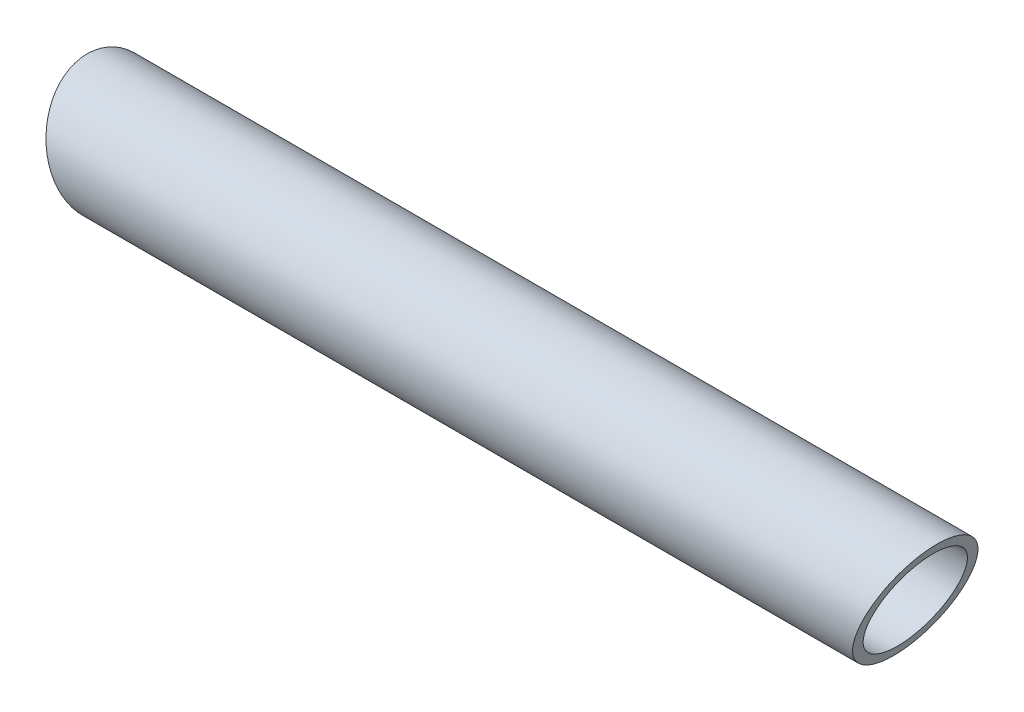
ISO-10303-21;
HEADER;
FILE_DESCRIPTION(('STEP AP214'),'2;1');
FILE_NAME('part.step','',(''),(''),'','','');
FILE_SCHEMA(('AUTOMOTIVE_DESIGN { 1 0 10303 214 1 1 1 1 }'));
ENDSEC;
DATA;
#1=APPLICATION_CONTEXT('core data for automotive mechanical design processes');
#2=APPLICATION_PROTOCOL_DEFINITION('international standard','automotive_design',2000,#1);
#3=PRODUCT_CONTEXT('',#1,'mechanical');
#4=PRODUCT('Part','Part','',(#3));
#5=PRODUCT_RELATED_PRODUCT_CATEGORY('part','',(#4));
#6=PRODUCT_DEFINITION_FORMATION('','',#4);
#7=PRODUCT_DEFINITION_CONTEXT('part definition',#1,'design');
#8=PRODUCT_DEFINITION('design','',#6,#7);
#9=PRODUCT_DEFINITION_SHAPE('','',#8);
#10=(LENGTH_UNIT() NAMED_UNIT(*) SI_UNIT(.MILLI.,.METRE.));
#11=(NAMED_UNIT(*) PLANE_ANGLE_UNIT() SI_UNIT($,.RADIAN.));
#12=(NAMED_UNIT(*) SI_UNIT($,.STERADIAN.) SOLID_ANGLE_UNIT());
#13=UNCERTAINTY_MEASURE_WITH_UNIT(LENGTH_MEASURE(1.E-05),#10,'distance_accuracy_value','');
#14=(GEOMETRIC_REPRESENTATION_CONTEXT(3) GLOBAL_UNCERTAINTY_ASSIGNED_CONTEXT((#13)) GLOBAL_UNIT_ASSIGNED_CONTEXT((#10,
#11,#12)) REPRESENTATION_CONTEXT('',''));
#15=CARTESIAN_POINT('',(0.,0.,0.));
#16=DIRECTION('',(0.,0.,1.));
#17=DIRECTION('',(1.,0.,0.));
#18=AXIS2_PLACEMENT_3D('',#15,#16,#17);
#19=CARTESIAN_POINT('',(-65.0000000000001,580.,-1140.));
#20=DIRECTION('',(1.,0.,0.));
#21=DIRECTION('',(0.,0.,-1.));
#22=AXIS2_PLACEMENT_3D('',#19,#20,#21);
#23=CYLINDRICAL_SURFACE('',#22,7.90000000000002);
#24=CARTESIAN_POINT('',(-64.9999999999999,580.,-1140.));
#25=DIRECTION('',(-0.939391078868926,-0.342847489332319,0.));
#26=DIRECTION('',(0.342847489332319,-0.939391078868926,0.));
#27=AXIS2_PLACEMENT_3D('',#24,#25,#26);
#28=ELLIPSE('',#27,8.40970302753142,7.90000000000002);
#29=CARTESIAN_POINT('',(-62.1167544309804,572.1,-1140.));
#30=VERTEX_POINT('',#29);
#31=EDGE_CURVE('E53',#30,#30,#28,.T.);
#32=ORIENTED_EDGE('',*,*,#31,.T.);
#33=EDGE_LOOP('',(#32));
#34=FACE_BOUND('',#33,.T.);
#35=CARTESIAN_POINT('',(64.9999999999999,580.,-1140.));
#36=DIRECTION('',(0.939391078868926,-0.342847489332319,0.));
#37=DIRECTION('',(0.342847489332319,0.939391078868926,0.));
#38=AXIS2_PLACEMENT_3D('',#35,#36,#37);
#39=ELLIPSE('',#38,8.40970302753142,7.90000000000002);
#40=CARTESIAN_POINT('',(67.8832455690194,587.9,-1140.));
#41=VERTEX_POINT('',#40);
#42=EDGE_CURVE('E43',#41,#41,#39,.T.);
#43=ORIENTED_EDGE('',*,*,#42,.T.);
#44=EDGE_LOOP('',(#43));
#45=FACE_BOUND('',#44,.T.);
#46=ADVANCED_FACE('F39',(#34,#45),#23,.F.);
#47=CARTESIAN_POINT('',(-65.0000000000001,580.,-1140.));
#48=DIRECTION('',(1.,0.,0.));
#49=DIRECTION('',(0.,0.,-1.));
#50=AXIS2_PLACEMENT_3D('',#47,#48,#49);
#51=CYLINDRICAL_SURFACE('',#50,9.49999999999999);
#52=CARTESIAN_POINT('',(-64.9999999999999,580.,-1140.));
#53=DIRECTION('',(-0.939391078868926,-0.342847489332319,0.));
#54=DIRECTION('',(0.342847489332319,-0.939391078868926,0.));
#55=AXIS2_PLACEMENT_3D('',#52,#53,#54);
#56=ELLIPSE('',#55,10.1129340204491,9.49999999999999);
#57=CARTESIAN_POINT('',(-61.5328059613055,570.5,-1140.));
#58=VERTEX_POINT('',#57);
#59=EDGE_CURVE('E47',#58,#58,#56,.T.);
#60=ORIENTED_EDGE('',*,*,#59,.F.);
#61=EDGE_LOOP('',(#60));
#62=FACE_BOUND('',#61,.T.);
#63=CARTESIAN_POINT('',(64.9999999999999,580.,-1140.));
#64=DIRECTION('',(0.939391078868926,-0.342847489332319,0.));
#65=DIRECTION('',(0.342847489332319,0.939391078868926,0.));
#66=AXIS2_PLACEMENT_3D('',#63,#64,#65);
#67=ELLIPSE('',#66,10.1129340204491,9.49999999999999);
#68=CARTESIAN_POINT('',(68.4671940386943,589.5,-1140.));
#69=VERTEX_POINT('',#68);
#70=EDGE_CURVE('E10',#69,#69,#67,.T.);
#71=ORIENTED_EDGE('',*,*,#70,.F.);
#72=EDGE_LOOP('',(#71));
#73=FACE_BOUND('',#72,.T.);
#74=ADVANCED_FACE('F67',(#62,#73),#51,.T.);
#75=CARTESIAN_POINT('',(-65.,580.,-1140.));
#76=DIRECTION('',(-0.939391078868926,-0.342847489332319,0.));
#77=DIRECTION('',(0.342847489332319,-0.939391078868926,0.));
#78=AXIS2_PLACEMENT_3D('',#75,#76,#77);
#79=PLANE('',#78);
#80=ORIENTED_EDGE('',*,*,#31,.F.);
#81=EDGE_LOOP('',(#80));
#82=FACE_BOUND('',#81,.T.);
#83=ORIENTED_EDGE('',*,*,#59,.T.);
#84=EDGE_LOOP('',(#83));
#85=FACE_BOUND('',#84,.T.);
#86=ADVANCED_FACE('F62',(#82,#85),#79,.T.);
#87=CARTESIAN_POINT('',(65.,580.,-1140.));
#88=DIRECTION('',(0.939391078868926,-0.342847489332319,0.));
#89=DIRECTION('',(0.342847489332319,0.939391078868926,0.));
#90=AXIS2_PLACEMENT_3D('',#87,#88,#89);
#91=PLANE('',#90);
#92=ORIENTED_EDGE('',*,*,#42,.F.);
#93=EDGE_LOOP('',(#92));
#94=FACE_BOUND('',#93,.T.);
#95=ORIENTED_EDGE('',*,*,#70,.T.);
#96=EDGE_LOOP('',(#95));
#97=FACE_BOUND('',#96,.T.);
#98=ADVANCED_FACE('F41',(#94,#97),#91,.T.);
#99=CLOSED_SHELL('',(#46,#74,#86,#98));
#100=MANIFOLD_SOLID_BREP('B2',#99);
#101=ADVANCED_BREP_SHAPE_REPRESENTATION('',(#18,#100),#14);
#102=SHAPE_DEFINITION_REPRESENTATION(#9,#101);
ENDSEC;
END-ISO-10303-21;
